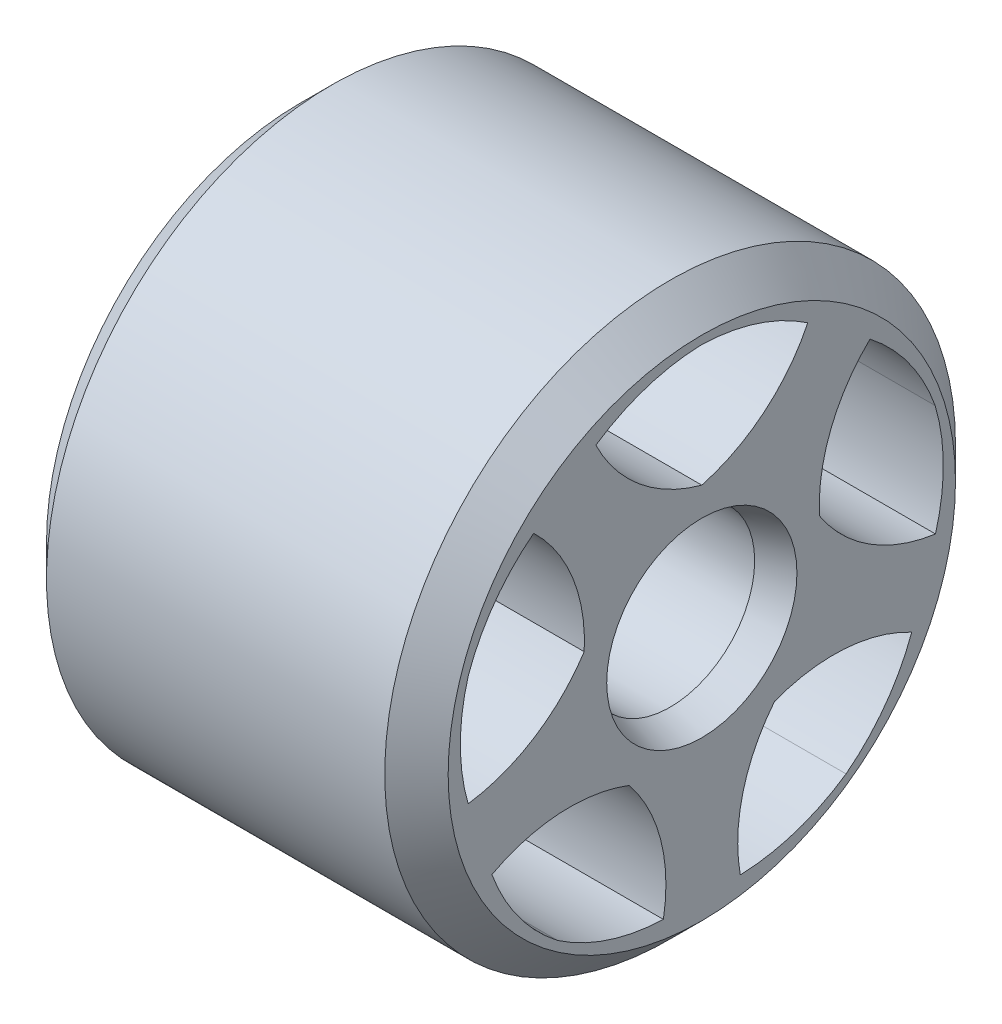
ISO-10303-21;
HEADER;
FILE_DESCRIPTION(('STEP AP214'),'2;1');
FILE_NAME('part.step','',(''),(''),'','','');
FILE_SCHEMA(('AUTOMOTIVE_DESIGN { 1 0 10303 214 1 1 1 1 }'));
ENDSEC;
DATA;
#1=APPLICATION_CONTEXT('core data for automotive mechanical design processes');
#2=APPLICATION_PROTOCOL_DEFINITION('international standard','automotive_design',2000,#1);
#3=PRODUCT_CONTEXT('',#1,'mechanical');
#4=PRODUCT('Part','Part','',(#3));
#5=PRODUCT_RELATED_PRODUCT_CATEGORY('part','',(#4));
#6=PRODUCT_DEFINITION_FORMATION('','',#4);
#7=PRODUCT_DEFINITION_CONTEXT('part definition',#1,'design');
#8=PRODUCT_DEFINITION('design','',#6,#7);
#9=PRODUCT_DEFINITION_SHAPE('','',#8);
#10=(LENGTH_UNIT() NAMED_UNIT(*) SI_UNIT(.MILLI.,.METRE.));
#11=(NAMED_UNIT(*) PLANE_ANGLE_UNIT() SI_UNIT($,.RADIAN.));
#12=(NAMED_UNIT(*) SI_UNIT($,.STERADIAN.) SOLID_ANGLE_UNIT());
#13=UNCERTAINTY_MEASURE_WITH_UNIT(LENGTH_MEASURE(1.E-05),#10,'distance_accuracy_value','');
#14=(GEOMETRIC_REPRESENTATION_CONTEXT(3) GLOBAL_UNCERTAINTY_ASSIGNED_CONTEXT((#13)) GLOBAL_UNIT_ASSIGNED_CONTEXT((#10,
#11,#12)) REPRESENTATION_CONTEXT('',''));
#15=CARTESIAN_POINT('',(0.,0.,0.));
#16=DIRECTION('',(0.,0.,1.));
#17=DIRECTION('',(1.,0.,0.));
#18=AXIS2_PLACEMENT_3D('',#15,#16,#17);
#19=CARTESIAN_POINT('',(9.5,0.,0.));
#20=DIRECTION('',(1.,0.,0.));
#21=DIRECTION('',(0.,0.,-1.));
#22=AXIS2_PLACEMENT_3D('',#19,#20,#21);
#23=PLANE('',#22);
#24=CARTESIAN_POINT('',(9.5,0.,0.));
#25=DIRECTION('',(1.,0.,0.));
#26=DIRECTION('',(0.,0.,-1.));
#27=AXIS2_PLACEMENT_3D('',#24,#25,#26);
#28=CIRCLE('',#27,4.50000000000001);
#29=CARTESIAN_POINT('',(9.5,0.,-4.50000000000001));
#30=VERTEX_POINT('',#29);
#31=EDGE_CURVE('E11',#30,#30,#28,.F.);
#32=ORIENTED_EDGE('',*,*,#31,.T.);
#33=EDGE_LOOP('',(#32));
#34=FACE_BOUND('',#33,.T.);
#35=CARTESIAN_POINT('',(9.5,0.,0.));
#36=DIRECTION('',(1.,0.,0.));
#37=DIRECTION('',(0.,0.,-1.));
#38=AXIS2_PLACEMENT_3D('',#35,#36,#37);
#39=CIRCLE('',#38,12.);
#40=CARTESIAN_POINT('',(9.5,0.,-12.));
#41=VERTEX_POINT('',#40);
#42=EDGE_CURVE('E344',#41,#41,#39,.T.);
#43=ORIENTED_EDGE('',*,*,#42,.T.);
#44=EDGE_LOOP('',(#43));
#45=FACE_BOUND('',#44,.T.);
#46=CARTESIAN_POINT('',(9.5,0.931815794103075,-2.02933749414677));
#47=DIRECTION('',(1.,0.,0.));
#48=DIRECTION('',(0.,-0.95105651629515,-0.309016994374958));
#49=AXIS2_PLACEMENT_3D('',#46,#47,#48);
#50=CIRCLE('',#49,9.39432433543306);
#51=CARTESIAN_POINT('',(9.5,-1.678595206542,-11.0536980879518));
#52=VERTEX_POINT('',#51);
#53=CARTESIAN_POINT('',(9.5,3.58728925984448,-11.0405410981085));
#54=VERTEX_POINT('',#53);
#55=EDGE_CURVE('E260',#52,#54,#50,.T.);
#56=ORIENTED_EDGE('',*,*,#55,.F.);
#57=CARTESIAN_POINT('',(9.5,6.08419028301145,-12.1309249973145));
#58=DIRECTION('',(1.,0.,0.));
#59=DIRECTION('',(0.,-0.95105651629515,-0.309016994374958));
#60=AXIS2_PLACEMENT_3D('',#57,#58,#59);
#61=CIRCLE('',#60,7.8371714521935);
#62=CARTESIAN_POINT('',(9.5,1.80765526838161,-5.56339086038598));
#63=VERTEX_POINT('',#62);
#64=EDGE_CURVE('E258',#63,#52,#61,.T.);
#65=ORIENTED_EDGE('',*,*,#64,.F.);
#66=CARTESIAN_POINT('',(9.5,2.2081654741207,-13.3903218008106));
#67=DIRECTION('',(1.,0.,0.));
#68=DIRECTION('',(0.,0.95105651629515,0.309016994374958));
#69=AXIS2_PLACEMENT_3D('',#66,#67,#68);
#70=CIRCLE('',#69,7.8371714521935);
#71=CARTESIAN_POINT('',(9.5,7.85521276816055,-7.95597609686846));
#72=VERTEX_POINT('',#71);
#73=EDGE_CURVE('E264',#72,#63,#70,.T.);
#74=ORIENTED_EDGE('',*,*,#73,.F.);
#75=CARTESIAN_POINT('',(9.5,0.43895983792731,-2.18947610171399));
#76=DIRECTION('',(1.,0.,0.));
#77=DIRECTION('',(0.,0.95105651629515,0.309016994374958));
#78=AXIS2_PLACEMENT_3D('',#75,#76,#77);
#79=CIRCLE('',#78,9.39432433543306);
#80=EDGE_CURVE('E262',#54,#72,#79,.T.);
#81=ORIENTED_EDGE('',*,*,#80,.F.);
#82=EDGE_LOOP('',(#56,#65,#74,#81));
#83=FACE_BOUND('',#82,.T.);
#84=CARTESIAN_POINT('',(9.5,-1.64206773156553,-1.51330925598209));
#85=DIRECTION('',(1.,0.,0.));
#86=DIRECTION('',(0.,-0.58778525229248,0.809016994374942));
#87=AXIS2_PLACEMENT_3D('',#84,#85,#86);
#88=CIRCLE('',#87,9.39432433543306);
#89=CARTESIAN_POINT('',(9.5,-11.0314060412036,-1.81934165046336));
#90=VERTEX_POINT('',#89);
#91=CARTESIAN_POINT('',(9.5,-9.3916452097499,-6.82342965282126));
#92=VERTEX_POINT('',#91);
#93=EDGE_CURVE('E235',#90,#92,#88,.T.);
#94=ORIENTED_EDGE('',*,*,#93,.F.);
#95=CARTESIAN_POINT('',(9.5,-9.65707707292231,-9.53507079669572));
#96=DIRECTION('',(1.,0.,0.));
#97=DIRECTION('',(0.,-0.58778525229248,0.809016994374942));
#98=AXIS2_PLACEMENT_3D('',#95,#96,#97);
#99=CIRCLE('',#98,7.8371714521935);
#100=CARTESIAN_POINT('',(9.5,-4.73250293256568,-3.43836464441911));
#101=VERTEX_POINT('',#100);
#102=EDGE_CURVE('E233',#101,#90,#99,.T.);
#103=ORIENTED_EDGE('',*,*,#102,.F.);
#104=CARTESIAN_POINT('',(9.5,-12.0525921460546,-6.23792715982025));
#105=DIRECTION('',(1.,0.,0.));
#106=DIRECTION('',(0.,0.58778525229248,-0.809016994374942));
#107=AXIS2_PLACEMENT_3D('',#104,#105,#106);
#108=CIRCLE('',#107,7.8371714521935);
#109=CARTESIAN_POINT('',(9.5,-5.13918867062257,-9.92928311081719));
#110=VERTEX_POINT('',#109);
#111=EDGE_CURVE('E239',#110,#101,#108,.T.);
#112=ORIENTED_EDGE('',*,*,#111,.F.);
#113=CARTESIAN_POINT('',(9.5,-1.94666946403999,-1.09406093846006));
#114=DIRECTION('',(1.,0.,0.));
#115=DIRECTION('',(0.,0.58778525229248,-0.809016994374942));
#116=AXIS2_PLACEMENT_3D('',#113,#114,#115);
#117=CIRCLE('',#116,9.39432433543306);
#118=EDGE_CURVE('E237',#92,#110,#117,.T.);
#119=ORIENTED_EDGE('',*,*,#118,.F.);
#120=EDGE_LOOP('',(#94,#103,#112,#119));
#121=FACE_BOUND('',#120,.T.);
#122=CARTESIAN_POINT('',(9.5,-1.94666946404,1.09406093846003));
#123=DIRECTION('',(1.,0.,0.));
#124=DIRECTION('',(0.,0.587785252292469,0.809016994374951));
#125=AXIS2_PLACEMENT_3D('',#122,#123,#124);
#126=CIRCLE('',#125,9.39432433543306);
#127=CARTESIAN_POINT('',(9.5,-5.13918867062272,9.92928311081712));
#128=VERTEX_POINT('',#127);
#129=CARTESIAN_POINT('',(9.5,-9.39164520975,6.82342965282112));
#130=VERTEX_POINT('',#129);
#131=EDGE_CURVE('E208',#128,#130,#126,.T.);
#132=ORIENTED_EDGE('',*,*,#131,.F.);
#133=CARTESIAN_POINT('',(9.5,-12.0525921460547,6.23792715982008));
#134=DIRECTION('',(1.,0.,0.));
#135=DIRECTION('',(0.,0.587785252292469,0.809016994374951));
#136=AXIS2_PLACEMENT_3D('',#133,#134,#135);
#137=CIRCLE('',#136,7.8371714521935);
#138=CARTESIAN_POINT('',(9.5,-4.73250293256573,3.43836464441905));
#139=VERTEX_POINT('',#138);
#140=EDGE_CURVE('E180',#139,#128,#137,.T.);
#141=ORIENTED_EDGE('',*,*,#140,.F.);
#142=CARTESIAN_POINT('',(9.5,-9.65707707292245,9.53507079669558));
#143=DIRECTION('',(1.,0.,0.));
#144=DIRECTION('',(0.,-0.587785252292469,-0.809016994374951));
#145=AXIS2_PLACEMENT_3D('',#142,#143,#144);
#146=CIRCLE('',#145,7.8371714521935);
#147=CARTESIAN_POINT('',(9.5,-11.0314060412037,1.81934165046321));
#148=VERTEX_POINT('',#147);
#149=EDGE_CURVE('E213',#148,#139,#146,.T.);
#150=ORIENTED_EDGE('',*,*,#149,.F.);
#151=CARTESIAN_POINT('',(9.5,-1.64206773156555,1.51330925598207));
#152=DIRECTION('',(1.,0.,0.));
#153=DIRECTION('',(0.,-0.587785252292469,-0.809016994374951));
#154=AXIS2_PLACEMENT_3D('',#151,#152,#153);
#155=CIRCLE('',#154,9.39432433543306);
#156=EDGE_CURVE('E210',#130,#148,#155,.T.);
#157=ORIENTED_EDGE('',*,*,#156,.F.);
#158=EDGE_LOOP('',(#132,#141,#150,#157));
#159=FACE_BOUND('',#158,.T.);
#160=CARTESIAN_POINT('',(9.5,0.438959837927279,2.18947610171399));
#161=DIRECTION('',(1.,0.,0.));
#162=DIRECTION('',(0.,0.951056516295155,-0.309016994374945));
#163=AXIS2_PLACEMENT_3D('',#160,#161,#162);
#164=CIRCLE('',#163,9.39432433543306);
#165=CARTESIAN_POINT('',(9.5,7.85521276816044,7.95597609686858));
#166=VERTEX_POINT('',#165);
#167=CARTESIAN_POINT('',(9.5,3.58728925984432,11.0405410981086));
#168=VERTEX_POINT('',#167);
#169=EDGE_CURVE('E286',#166,#168,#164,.T.);
#170=ORIENTED_EDGE('',*,*,#169,.F.);
#171=CARTESIAN_POINT('',(9.5,2.20816547412051,13.3903218008106));
#172=DIRECTION('',(1.,0.,0.));
#173=DIRECTION('',(0.,0.951056516295155,-0.309016994374945));
#174=AXIS2_PLACEMENT_3D('',#171,#172,#173);
#175=CIRCLE('',#174,7.8371714521935);
#176=CARTESIAN_POINT('',(9.5,1.80765526838153,5.56339086038601));
#177=VERTEX_POINT('',#176);
#178=EDGE_CURVE('E284',#177,#166,#175,.T.);
#179=ORIENTED_EDGE('',*,*,#178,.F.);
#180=CARTESIAN_POINT('',(9.5,6.08419028301128,12.1309249973146));
#181=DIRECTION('',(1.,0.,0.));
#182=DIRECTION('',(0.,-0.951056516295155,0.309016994374945));
#183=AXIS2_PLACEMENT_3D('',#180,#181,#182);
#184=CIRCLE('',#183,7.8371714521935);
#185=CARTESIAN_POINT('',(9.5,-1.67859520654215,11.0536980879518));
#186=VERTEX_POINT('',#185);
#187=EDGE_CURVE('E291',#186,#177,#184,.T.);
#188=ORIENTED_EDGE('',*,*,#187,.F.);
#189=CARTESIAN_POINT('',(9.5,0.931815794103047,2.02933749414678));
#190=DIRECTION('',(1.,0.,0.));
#191=DIRECTION('',(0.,-0.951056516295155,0.309016994374945));
#192=AXIS2_PLACEMENT_3D('',#189,#190,#191);
#193=CIRCLE('',#192,9.39432433543306);
#194=EDGE_CURVE('E288',#168,#186,#193,.T.);
#195=ORIENTED_EDGE('',*,*,#194,.F.);
#196=EDGE_LOOP('',(#170,#179,#188,#195));
#197=FACE_BOUND('',#196,.T.);
#198=CARTESIAN_POINT('',(9.5,2.21796156357521,0.259109709954825));
#199=DIRECTION('',(1.,0.,0.));
#200=DIRECTION('',(0.,0.,-1.));
#201=AXIS2_PLACEMENT_3D('',#198,#199,#200);
#202=CIRCLE('',#201,9.39432433543306);
#203=CARTESIAN_POINT('',(9.5,9.99397715020798,-5.01221946927066));
#204=VERTEX_POINT('',#203);
#205=CARTESIAN_POINT('',(9.5,11.6087118998112,0.));
#206=VERTEX_POINT('',#205);
#207=EDGE_CURVE('E316',#204,#206,#202,.T.);
#208=ORIENTED_EDGE('',*,*,#207,.F.);
#209=CARTESIAN_POINT('',(9.5,13.4173134618452,2.03774683337949));
#210=DIRECTION('',(1.,0.,0.));
#211=DIRECTION('',(0.,0.,-1.));
#212=AXIS2_PLACEMENT_3D('',#209,#210,#211);
#213=CIRCLE('',#212,7.8371714521935);
#214=CARTESIAN_POINT('',(9.5,5.84969532836832,0.));
#215=VERTEX_POINT('',#214);
#216=EDGE_CURVE('E314',#215,#204,#213,.T.);
#217=ORIENTED_EDGE('',*,*,#216,.F.);
#218=CARTESIAN_POINT('',(9.5,13.4173134618452,-2.03774683337949));
#219=DIRECTION('',(1.,0.,0.));
#220=DIRECTION('',(0.,0.,1.));
#221=AXIS2_PLACEMENT_3D('',#218,#219,#220);
#222=CIRCLE('',#221,7.8371714521935);
#223=CARTESIAN_POINT('',(9.5,9.99397715020798,5.01221946927066));
#224=VERTEX_POINT('',#223);
#225=EDGE_CURVE('E321',#224,#215,#222,.T.);
#226=ORIENTED_EDGE('',*,*,#225,.F.);
#227=CARTESIAN_POINT('',(9.5,2.21796156357521,-0.259109709954825));
#228=DIRECTION('',(1.,0.,0.));
#229=DIRECTION('',(0.,0.,1.));
#230=AXIS2_PLACEMENT_3D('',#227,#228,#229);
#231=CIRCLE('',#230,9.39432433543306);
#232=EDGE_CURVE('E318',#206,#224,#231,.T.);
#233=ORIENTED_EDGE('',*,*,#232,.F.);
#234=EDGE_LOOP('',(#208,#217,#226,#233));
#235=FACE_BOUND('',#234,.T.);
#236=ADVANCED_FACE('F35',(#34,#45,#83,#121,#159,#197,#235),#23,.T.);
#237=CARTESIAN_POINT('',(-9.5,0.,0.));
#238=DIRECTION('',(1.,0.,0.));
#239=DIRECTION('',(0.,0.,-1.));
#240=AXIS2_PLACEMENT_3D('',#237,#238,#239);
#241=PLANE('',#240);
#242=CARTESIAN_POINT('',(-9.5,0.,0.));
#243=DIRECTION('',(1.,0.,0.));
#244=DIRECTION('',(0.,0.,-1.));
#245=AXIS2_PLACEMENT_3D('',#242,#243,#244);
#246=CIRCLE('',#245,12.);
#247=CARTESIAN_POINT('',(-9.5,0.,-12.));
#248=VERTEX_POINT('',#247);
#249=EDGE_CURVE('E341',#248,#248,#246,.F.);
#250=ORIENTED_EDGE('',*,*,#249,.T.);
#251=EDGE_LOOP('',(#250));
#252=FACE_BOUND('',#251,.T.);
#253=CARTESIAN_POINT('',(-9.5,6.08419028301145,-12.1309249973145));
#254=DIRECTION('',(1.,0.,0.));
#255=DIRECTION('',(0.,-0.95105651629515,-0.309016994374958));
#256=AXIS2_PLACEMENT_3D('',#253,#254,#255);
#257=CIRCLE('',#256,7.8371714521935);
#258=CARTESIAN_POINT('',(-9.5,1.80765526838161,-5.56339086038598));
#259=VERTEX_POINT('',#258);
#260=CARTESIAN_POINT('',(-9.5,-1.678595206542,-11.0536980879518));
#261=VERTEX_POINT('',#260);
#262=EDGE_CURVE('E246',#259,#261,#257,.T.);
#263=ORIENTED_EDGE('',*,*,#262,.T.);
#264=CARTESIAN_POINT('',(-9.5,0.931815794103075,-2.02933749414677));
#265=DIRECTION('',(1.,0.,0.));
#266=DIRECTION('',(0.,-0.95105651629515,-0.309016994374958));
#267=AXIS2_PLACEMENT_3D('',#264,#265,#266);
#268=CIRCLE('',#267,9.39432433543306);
#269=CARTESIAN_POINT('',(-9.5,3.58728925984448,-11.0405410981085));
#270=VERTEX_POINT('',#269);
#271=EDGE_CURVE('E249',#261,#270,#268,.T.);
#272=ORIENTED_EDGE('',*,*,#271,.T.);
#273=CARTESIAN_POINT('',(-9.5,0.43895983792731,-2.18947610171399));
#274=DIRECTION('',(1.,0.,0.));
#275=DIRECTION('',(0.,0.95105651629515,0.309016994374958));
#276=AXIS2_PLACEMENT_3D('',#273,#274,#275);
#277=CIRCLE('',#276,9.39432433543306);
#278=CARTESIAN_POINT('',(-9.5,7.85521276816055,-7.95597609686846));
#279=VERTEX_POINT('',#278);
#280=EDGE_CURVE('E252',#270,#279,#277,.T.);
#281=ORIENTED_EDGE('',*,*,#280,.T.);
#282=CARTESIAN_POINT('',(-9.5,2.2081654741207,-13.3903218008106));
#283=DIRECTION('',(1.,0.,0.));
#284=DIRECTION('',(0.,0.95105651629515,0.309016994374958));
#285=AXIS2_PLACEMENT_3D('',#282,#283,#284);
#286=CIRCLE('',#285,7.8371714521935);
#287=EDGE_CURVE('E255',#279,#259,#286,.T.);
#288=ORIENTED_EDGE('',*,*,#287,.T.);
#289=EDGE_LOOP('',(#263,#272,#281,#288));
#290=FACE_BOUND('',#289,.T.);
#291=CARTESIAN_POINT('',(-9.5,-9.65707707292231,-9.53507079669572));
#292=DIRECTION('',(1.,0.,0.));
#293=DIRECTION('',(0.,-0.58778525229248,0.809016994374942));
#294=AXIS2_PLACEMENT_3D('',#291,#292,#293);
#295=CIRCLE('',#294,7.8371714521935);
#296=CARTESIAN_POINT('',(-9.5,-4.73250293256567,-3.43836464441911));
#297=VERTEX_POINT('',#296);
#298=CARTESIAN_POINT('',(-9.5,-11.0314060412036,-1.81934165046336));
#299=VERTEX_POINT('',#298);
#300=EDGE_CURVE('E220',#297,#299,#295,.T.);
#301=ORIENTED_EDGE('',*,*,#300,.T.);
#302=CARTESIAN_POINT('',(-9.5,-1.64206773156553,-1.51330925598209));
#303=DIRECTION('',(1.,0.,0.));
#304=DIRECTION('',(0.,-0.58778525229248,0.809016994374942));
#305=AXIS2_PLACEMENT_3D('',#302,#303,#304);
#306=CIRCLE('',#305,9.39432433543306);
#307=CARTESIAN_POINT('',(-9.5,-9.3916452097499,-6.82342965282126));
#308=VERTEX_POINT('',#307);
#309=EDGE_CURVE('E223',#299,#308,#306,.T.);
#310=ORIENTED_EDGE('',*,*,#309,.T.);
#311=CARTESIAN_POINT('',(-9.5,-1.94666946403999,-1.09406093846006));
#312=DIRECTION('',(1.,0.,0.));
#313=DIRECTION('',(0.,0.58778525229248,-0.809016994374942));
#314=AXIS2_PLACEMENT_3D('',#311,#312,#313);
#315=CIRCLE('',#314,9.39432433543306);
#316=CARTESIAN_POINT('',(-9.5,-5.13918867062257,-9.92928311081719));
#317=VERTEX_POINT('',#316);
#318=EDGE_CURVE('E227',#308,#317,#315,.T.);
#319=ORIENTED_EDGE('',*,*,#318,.T.);
#320=CARTESIAN_POINT('',(-9.5,-12.0525921460546,-6.23792715982025));
#321=DIRECTION('',(1.,0.,0.));
#322=DIRECTION('',(0.,0.58778525229248,-0.809016994374942));
#323=AXIS2_PLACEMENT_3D('',#320,#321,#322);
#324=CIRCLE('',#323,7.8371714521935);
#325=EDGE_CURVE('E230',#317,#297,#324,.T.);
#326=ORIENTED_EDGE('',*,*,#325,.T.);
#327=EDGE_LOOP('',(#301,#310,#319,#326));
#328=FACE_BOUND('',#327,.T.);
#329=CARTESIAN_POINT('',(-9.5,-12.0525921460547,6.23792715982008));
#330=DIRECTION('',(1.,0.,0.));
#331=DIRECTION('',(0.,0.587785252292469,0.809016994374951));
#332=AXIS2_PLACEMENT_3D('',#329,#330,#331);
#333=CIRCLE('',#332,7.8371714521935);
#334=CARTESIAN_POINT('',(-9.5,-4.73250293256573,3.43836464441905));
#335=VERTEX_POINT('',#334);
#336=CARTESIAN_POINT('',(-9.5,-5.13918867062272,9.92928311081712));
#337=VERTEX_POINT('',#336);
#338=EDGE_CURVE('E177',#335,#337,#333,.T.);
#339=ORIENTED_EDGE('',*,*,#338,.T.);
#340=CARTESIAN_POINT('',(-9.5,-1.94666946404,1.09406093846003));
#341=DIRECTION('',(1.,0.,0.));
#342=DIRECTION('',(0.,0.587785252292469,0.809016994374951));
#343=AXIS2_PLACEMENT_3D('',#340,#341,#342);
#344=CIRCLE('',#343,9.39432433543306);
#345=CARTESIAN_POINT('',(-9.5,-9.39164520975,6.82342965282112));
#346=VERTEX_POINT('',#345);
#347=EDGE_CURVE('E187',#337,#346,#344,.T.);
#348=ORIENTED_EDGE('',*,*,#347,.T.);
#349=CARTESIAN_POINT('',(-9.5,-1.64206773156555,1.51330925598207));
#350=DIRECTION('',(1.,0.,0.));
#351=DIRECTION('',(0.,-0.587785252292469,-0.809016994374951));
#352=AXIS2_PLACEMENT_3D('',#349,#350,#351);
#353=CIRCLE('',#352,9.39432433543306);
#354=CARTESIAN_POINT('',(-9.5,-11.0314060412037,1.8193416504632));
#355=VERTEX_POINT('',#354);
#356=EDGE_CURVE('E193',#346,#355,#353,.T.);
#357=ORIENTED_EDGE('',*,*,#356,.T.);
#358=CARTESIAN_POINT('',(-9.5,-9.65707707292245,9.53507079669558));
#359=DIRECTION('',(1.,0.,0.));
#360=DIRECTION('',(0.,-0.587785252292469,-0.809016994374951));
#361=AXIS2_PLACEMENT_3D('',#358,#359,#360);
#362=CIRCLE('',#361,7.8371714521935);
#363=EDGE_CURVE('E199',#355,#335,#362,.T.);
#364=ORIENTED_EDGE('',*,*,#363,.T.);
#365=EDGE_LOOP('',(#339,#348,#357,#364));
#366=FACE_BOUND('',#365,.T.);
#367=CARTESIAN_POINT('',(-9.5,2.20816547412051,13.3903218008106));
#368=DIRECTION('',(1.,0.,0.));
#369=DIRECTION('',(0.,0.951056516295155,-0.309016994374945));
#370=AXIS2_PLACEMENT_3D('',#367,#368,#369);
#371=CIRCLE('',#370,7.8371714521935);
#372=CARTESIAN_POINT('',(-9.5,1.80765526838153,5.56339086038601));
#373=VERTEX_POINT('',#372);
#374=CARTESIAN_POINT('',(-9.5,7.85521276816044,7.95597609686858));
#375=VERTEX_POINT('',#374);
#376=EDGE_CURVE('E183',#373,#375,#371,.T.);
#377=ORIENTED_EDGE('',*,*,#376,.T.);
#378=CARTESIAN_POINT('',(-9.5,0.438959837927279,2.18947610171399));
#379=DIRECTION('',(1.,0.,0.));
#380=DIRECTION('',(0.,0.951056516295155,-0.309016994374945));
#381=AXIS2_PLACEMENT_3D('',#378,#379,#380);
#382=CIRCLE('',#381,9.39432433543306);
#383=CARTESIAN_POINT('',(-9.5,3.58728925984432,11.0405410981086));
#384=VERTEX_POINT('',#383);
#385=EDGE_CURVE('E275',#375,#384,#382,.T.);
#386=ORIENTED_EDGE('',*,*,#385,.T.);
#387=CARTESIAN_POINT('',(-9.5,0.931815794103047,2.02933749414678));
#388=DIRECTION('',(1.,0.,0.));
#389=DIRECTION('',(0.,-0.951056516295155,0.309016994374945));
#390=AXIS2_PLACEMENT_3D('',#387,#388,#389);
#391=CIRCLE('',#390,9.39432433543306);
#392=CARTESIAN_POINT('',(-9.5,-1.67859520654215,11.0536980879518));
#393=VERTEX_POINT('',#392);
#394=EDGE_CURVE('E278',#384,#393,#391,.T.);
#395=ORIENTED_EDGE('',*,*,#394,.T.);
#396=CARTESIAN_POINT('',(-9.5,6.08419028301128,12.1309249973146));
#397=DIRECTION('',(1.,0.,0.));
#398=DIRECTION('',(0.,-0.951056516295155,0.309016994374945));
#399=AXIS2_PLACEMENT_3D('',#396,#397,#398);
#400=CIRCLE('',#399,7.8371714521935);
#401=EDGE_CURVE('E281',#393,#373,#400,.T.);
#402=ORIENTED_EDGE('',*,*,#401,.T.);
#403=EDGE_LOOP('',(#377,#386,#395,#402));
#404=FACE_BOUND('',#403,.T.);
#405=CARTESIAN_POINT('',(-9.5,13.4173134618452,2.03774683337949));
#406=DIRECTION('',(1.,0.,0.));
#407=DIRECTION('',(0.,0.,-1.));
#408=AXIS2_PLACEMENT_3D('',#405,#406,#407);
#409=CIRCLE('',#408,7.8371714521935);
#410=CARTESIAN_POINT('',(-9.5,5.84969532836832,0.));
#411=VERTEX_POINT('',#410);
#412=CARTESIAN_POINT('',(-9.5,9.99397715020798,-5.01221946927066));
#413=VERTEX_POINT('',#412);
#414=EDGE_CURVE('E302',#411,#413,#409,.T.);
#415=ORIENTED_EDGE('',*,*,#414,.T.);
#416=CARTESIAN_POINT('',(-9.5,2.21796156357521,0.259109709954825));
#417=DIRECTION('',(1.,0.,0.));
#418=DIRECTION('',(0.,0.,-1.));
#419=AXIS2_PLACEMENT_3D('',#416,#417,#418);
#420=CIRCLE('',#419,9.39432433543306);
#421=CARTESIAN_POINT('',(-9.5,11.6087118998112,0.));
#422=VERTEX_POINT('',#421);
#423=EDGE_CURVE('E305',#413,#422,#420,.T.);
#424=ORIENTED_EDGE('',*,*,#423,.T.);
#425=CARTESIAN_POINT('',(-9.5,2.21796156357521,-0.259109709954825));
#426=DIRECTION('',(1.,0.,0.));
#427=DIRECTION('',(0.,0.,1.));
#428=AXIS2_PLACEMENT_3D('',#425,#426,#427);
#429=CIRCLE('',#428,9.39432433543306);
#430=CARTESIAN_POINT('',(-9.5,9.99397715020798,5.01221946927066));
#431=VERTEX_POINT('',#430);
#432=EDGE_CURVE('E308',#422,#431,#429,.T.);
#433=ORIENTED_EDGE('',*,*,#432,.T.);
#434=CARTESIAN_POINT('',(-9.5,13.4173134618452,-2.03774683337949));
#435=DIRECTION('',(1.,0.,0.));
#436=DIRECTION('',(0.,0.,1.));
#437=AXIS2_PLACEMENT_3D('',#434,#435,#436);
#438=CIRCLE('',#437,7.8371714521935);
#439=EDGE_CURVE('E311',#431,#411,#438,.T.);
#440=ORIENTED_EDGE('',*,*,#439,.T.);
#441=EDGE_LOOP('',(#415,#424,#433,#440));
#442=FACE_BOUND('',#441,.T.);
#443=CARTESIAN_POINT('',(-9.5,0.,0.));
#444=DIRECTION('',(1.,0.,0.));
#445=DIRECTION('',(0.,0.,-1.));
#446=AXIS2_PLACEMENT_3D('',#443,#444,#445);
#447=CIRCLE('',#446,4.);
#448=CARTESIAN_POINT('',(-9.5,0.,-4.));
#449=VERTEX_POINT('',#448);
#450=EDGE_CURVE('E332',#449,#449,#447,.T.);
#451=ORIENTED_EDGE('',*,*,#450,.T.);
#452=EDGE_LOOP('',(#451));
#453=FACE_BOUND('',#452,.T.);
#454=ADVANCED_FACE('F196',(#252,#290,#328,#366,#404,#442,#453),#241,.F.);
#455=CARTESIAN_POINT('',(9.5,0.,0.));
#456=DIRECTION('',(-1.,0.,0.));
#457=DIRECTION('',(0.,0.,1.));
#458=AXIS2_PLACEMENT_3D('',#455,#456,#457);
#459=CYLINDRICAL_SURFACE('',#458,13.5);
#460=CARTESIAN_POINT('',(-8.,0.,0.));
#461=DIRECTION('',(1.,0.,0.));
#462=DIRECTION('',(0.,0.,-1.));
#463=AXIS2_PLACEMENT_3D('',#460,#461,#462);
#464=CIRCLE('',#463,13.5);
#465=CARTESIAN_POINT('',(-8.,0.,-13.5));
#466=VERTEX_POINT('',#465);
#467=EDGE_CURVE('E338',#466,#466,#464,.T.);
#468=ORIENTED_EDGE('',*,*,#467,.T.);
#469=EDGE_LOOP('',(#468));
#470=FACE_BOUND('',#469,.T.);
#471=CARTESIAN_POINT('',(7.99999999999998,0.,0.));
#472=DIRECTION('',(1.,0.,0.));
#473=DIRECTION('',(0.,0.,-1.));
#474=AXIS2_PLACEMENT_3D('',#471,#472,#473);
#475=CIRCLE('',#474,13.5);
#476=CARTESIAN_POINT('',(7.99999999999998,0.,-13.5));
#477=VERTEX_POINT('',#476);
#478=EDGE_CURVE('E335',#477,#477,#475,.F.);
#479=ORIENTED_EDGE('',*,*,#478,.T.);
#480=EDGE_LOOP('',(#479));
#481=FACE_BOUND('',#480,.T.);
#482=ADVANCED_FACE('F367',(#470,#481),#459,.T.);
#483=CARTESIAN_POINT('',(9.5,0.,0.));
#484=DIRECTION('',(-1.,0.,0.));
#485=DIRECTION('',(0.,0.,1.));
#486=AXIS2_PLACEMENT_3D('',#483,#484,#485);
#487=CYLINDRICAL_SURFACE('',#486,4.);
#488=CARTESIAN_POINT('',(7.99999999999997,0.,0.));
#489=DIRECTION('',(1.,0.,0.));
#490=DIRECTION('',(0.,0.,-1.));
#491=AXIS2_PLACEMENT_3D('',#488,#489,#490);
#492=CIRCLE('',#491,4.);
#493=CARTESIAN_POINT('',(7.99999999999997,0.,-4.));
#494=VERTEX_POINT('',#493);
#495=EDGE_CURVE('E44',#494,#494,#492,.T.);
#496=ORIENTED_EDGE('',*,*,#495,.T.);
#497=EDGE_LOOP('',(#496));
#498=FACE_BOUND('',#497,.T.);
#499=ORIENTED_EDGE('',*,*,#450,.F.);
#500=EDGE_LOOP('',(#499));
#501=FACE_BOUND('',#500,.T.);
#502=ADVANCED_FACE('F349',(#498,#501),#487,.F.);
#503=CARTESIAN_POINT('',(9.5,13.4173134618452,2.03774683337949));
#504=DIRECTION('',(-1.,0.,0.));
#505=DIRECTION('',(0.,0.,1.));
#506=AXIS2_PLACEMENT_3D('',#503,#504,#505);
#507=CYLINDRICAL_SURFACE('',#506,7.8371714521935);
#508=DIRECTION('',(-1.,0.,0.));
#509=VECTOR('',#508,1.);
#510=CARTESIAN_POINT('',(9.5,5.84969532836832,0.));
#511=LINE('',#510,#509);
#512=EDGE_CURVE('E323',#215,#411,#511,.T.);
#513=ORIENTED_EDGE('',*,*,#512,.F.);
#514=ORIENTED_EDGE('',*,*,#216,.T.);
#515=DIRECTION('',(-1.,0.,0.));
#516=VECTOR('',#515,1.);
#517=CARTESIAN_POINT('',(9.5,9.99397715020798,-5.01221946927066));
#518=LINE('',#517,#516);
#519=EDGE_CURVE('E330',#204,#413,#518,.T.);
#520=ORIENTED_EDGE('',*,*,#519,.T.);
#521=ORIENTED_EDGE('',*,*,#414,.F.);
#522=EDGE_LOOP('',(#513,#514,#520,#521));
#523=FACE_BOUND('',#522,.T.);
#524=ADVANCED_FACE('F432',(#523),#507,.F.);
#525=CARTESIAN_POINT('',(9.5,2.21796156357521,0.259109709954825));
#526=DIRECTION('',(-1.,0.,0.));
#527=DIRECTION('',(0.,0.,1.));
#528=AXIS2_PLACEMENT_3D('',#525,#526,#527);
#529=CYLINDRICAL_SURFACE('',#528,9.39432433543306);
#530=ORIENTED_EDGE('',*,*,#519,.F.);
#531=ORIENTED_EDGE('',*,*,#207,.T.);
#532=DIRECTION('',(-1.,0.,0.));
#533=VECTOR('',#532,1.);
#534=CARTESIAN_POINT('',(9.5,11.6087118998112,0.));
#535=LINE('',#534,#533);
#536=EDGE_CURVE('E328',#206,#422,#535,.T.);
#537=ORIENTED_EDGE('',*,*,#536,.T.);
#538=ORIENTED_EDGE('',*,*,#423,.F.);
#539=EDGE_LOOP('',(#530,#531,#537,#538));
#540=FACE_BOUND('',#539,.T.);
#541=ADVANCED_FACE('F422',(#540),#529,.F.);
#542=CARTESIAN_POINT('',(9.5,2.21796156357521,-0.259109709954825));
#543=DIRECTION('',(-1.,0.,0.));
#544=DIRECTION('',(0.,0.,1.));
#545=AXIS2_PLACEMENT_3D('',#542,#543,#544);
#546=CYLINDRICAL_SURFACE('',#545,9.39432433543306);
#547=ORIENTED_EDGE('',*,*,#536,.F.);
#548=ORIENTED_EDGE('',*,*,#232,.T.);
#549=DIRECTION('',(-1.,0.,0.));
#550=VECTOR('',#549,1.);
#551=CARTESIAN_POINT('',(9.5,9.99397715020798,5.01221946927066));
#552=LINE('',#551,#550);
#553=EDGE_CURVE('E326',#224,#431,#552,.T.);
#554=ORIENTED_EDGE('',*,*,#553,.T.);
#555=ORIENTED_EDGE('',*,*,#432,.F.);
#556=EDGE_LOOP('',(#547,#548,#554,#555));
#557=FACE_BOUND('',#556,.T.);
#558=ADVANCED_FACE('F426',(#557),#546,.F.);
#559=CARTESIAN_POINT('',(9.5,13.4173134618452,-2.03774683337949));
#560=DIRECTION('',(-1.,0.,0.));
#561=DIRECTION('',(0.,0.,1.));
#562=AXIS2_PLACEMENT_3D('',#559,#560,#561);
#563=CYLINDRICAL_SURFACE('',#562,7.8371714521935);
#564=ORIENTED_EDGE('',*,*,#553,.F.);
#565=ORIENTED_EDGE('',*,*,#225,.T.);
#566=ORIENTED_EDGE('',*,*,#512,.T.);
#567=ORIENTED_EDGE('',*,*,#439,.F.);
#568=EDGE_LOOP('',(#564,#565,#566,#567));
#569=FACE_BOUND('',#568,.T.);
#570=ADVANCED_FACE('F434',(#569),#563,.F.);
#571=CARTESIAN_POINT('',(9.5,2.20816547412051,13.3903218008106));
#572=DIRECTION('',(-1.,0.,0.));
#573=DIRECTION('',(0.,0.,1.));
#574=AXIS2_PLACEMENT_3D('',#571,#572,#573);
#575=CYLINDRICAL_SURFACE('',#574,7.8371714521935);
#576=DIRECTION('',(-1.,0.,0.));
#577=VECTOR('',#576,1.);
#578=CARTESIAN_POINT('',(9.5,1.80765526838153,5.56339086038601));
#579=LINE('',#578,#577);
#580=EDGE_CURVE('E293',#177,#373,#579,.T.);
#581=ORIENTED_EDGE('',*,*,#580,.F.);
#582=ORIENTED_EDGE('',*,*,#178,.T.);
#583=DIRECTION('',(-1.,0.,0.));
#584=VECTOR('',#583,1.);
#585=CARTESIAN_POINT('',(9.5,7.85521276816044,7.95597609686858));
#586=LINE('',#585,#584);
#587=EDGE_CURVE('E300',#166,#375,#586,.T.);
#588=ORIENTED_EDGE('',*,*,#587,.T.);
#589=ORIENTED_EDGE('',*,*,#376,.F.);
#590=EDGE_LOOP('',(#581,#582,#588,#589));
#591=FACE_BOUND('',#590,.T.);
#592=ADVANCED_FACE('F436',(#591),#575,.F.);
#593=CARTESIAN_POINT('',(9.5,0.438959837927279,2.18947610171399));
#594=DIRECTION('',(-1.,0.,0.));
#595=DIRECTION('',(0.,0.,1.));
#596=AXIS2_PLACEMENT_3D('',#593,#594,#595);
#597=CYLINDRICAL_SURFACE('',#596,9.39432433543306);
#598=ORIENTED_EDGE('',*,*,#587,.F.);
#599=ORIENTED_EDGE('',*,*,#169,.T.);
#600=DIRECTION('',(-1.,0.,0.));
#601=VECTOR('',#600,1.);
#602=CARTESIAN_POINT('',(9.5,3.58728925984432,11.0405410981086));
#603=LINE('',#602,#601);
#604=EDGE_CURVE('E298',#168,#384,#603,.T.);
#605=ORIENTED_EDGE('',*,*,#604,.T.);
#606=ORIENTED_EDGE('',*,*,#385,.F.);
#607=EDGE_LOOP('',(#598,#599,#605,#606));
#608=FACE_BOUND('',#607,.T.);
#609=ADVANCED_FACE('F442',(#608),#597,.F.);
#610=CARTESIAN_POINT('',(9.5,0.931815794103047,2.02933749414678));
#611=DIRECTION('',(-1.,0.,0.));
#612=DIRECTION('',(0.,0.,1.));
#613=AXIS2_PLACEMENT_3D('',#610,#611,#612);
#614=CYLINDRICAL_SURFACE('',#613,9.39432433543306);
#615=ORIENTED_EDGE('',*,*,#604,.F.);
#616=ORIENTED_EDGE('',*,*,#194,.T.);
#617=DIRECTION('',(-1.,0.,0.));
#618=VECTOR('',#617,1.);
#619=CARTESIAN_POINT('',(9.5,-1.67859520654215,11.0536980879518));
#620=LINE('',#619,#618);
#621=EDGE_CURVE('E296',#186,#393,#620,.T.);
#622=ORIENTED_EDGE('',*,*,#621,.T.);
#623=ORIENTED_EDGE('',*,*,#394,.F.);
#624=EDGE_LOOP('',(#615,#616,#622,#623));
#625=FACE_BOUND('',#624,.T.);
#626=ADVANCED_FACE('F585',(#625),#614,.F.);
#627=CARTESIAN_POINT('',(9.5,6.08419028301128,12.1309249973146));
#628=DIRECTION('',(-1.,0.,0.));
#629=DIRECTION('',(0.,0.,1.));
#630=AXIS2_PLACEMENT_3D('',#627,#628,#629);
#631=CYLINDRICAL_SURFACE('',#630,7.8371714521935);
#632=ORIENTED_EDGE('',*,*,#621,.F.);
#633=ORIENTED_EDGE('',*,*,#187,.T.);
#634=ORIENTED_EDGE('',*,*,#580,.T.);
#635=ORIENTED_EDGE('',*,*,#401,.F.);
#636=EDGE_LOOP('',(#632,#633,#634,#635));
#637=FACE_BOUND('',#636,.T.);
#638=ADVANCED_FACE('F576',(#637),#631,.F.);
#639=CARTESIAN_POINT('',(9.5,-12.0525921460547,6.23792715982008));
#640=DIRECTION('',(-1.,0.,0.));
#641=DIRECTION('',(0.,0.,1.));
#642=AXIS2_PLACEMENT_3D('',#639,#640,#641);
#643=CYLINDRICAL_SURFACE('',#642,7.8371714521935);
#644=DIRECTION('',(-1.,0.,0.));
#645=VECTOR('',#644,1.);
#646=CARTESIAN_POINT('',(9.5,-4.73250293256573,3.43836464441905));
#647=LINE('',#646,#645);
#648=EDGE_CURVE('E215',#139,#335,#647,.T.);
#649=ORIENTED_EDGE('',*,*,#648,.F.);
#650=ORIENTED_EDGE('',*,*,#140,.T.);
#651=DIRECTION('',(-1.,0.,0.));
#652=VECTOR('',#651,1.);
#653=CARTESIAN_POINT('',(9.5,-5.13918867062272,9.92928311081712));
#654=LINE('',#653,#652);
#655=EDGE_CURVE('E172',#128,#337,#654,.T.);
#656=ORIENTED_EDGE('',*,*,#655,.T.);
#657=ORIENTED_EDGE('',*,*,#338,.F.);
#658=EDGE_LOOP('',(#649,#650,#656,#657));
#659=FACE_BOUND('',#658,.T.);
#660=ADVANCED_FACE('F175',(#659),#643,.F.);
#661=CARTESIAN_POINT('',(9.5,-1.94666946404,1.09406093846003));
#662=DIRECTION('',(-1.,0.,0.));
#663=DIRECTION('',(0.,0.,1.));
#664=AXIS2_PLACEMENT_3D('',#661,#662,#663);
#665=CYLINDRICAL_SURFACE('',#664,9.39432433543306);
#666=ORIENTED_EDGE('',*,*,#655,.F.);
#667=ORIENTED_EDGE('',*,*,#131,.T.);
#668=DIRECTION('',(-1.,0.,0.));
#669=VECTOR('',#668,1.);
#670=CARTESIAN_POINT('',(9.5,-9.39164520975,6.82342965282112));
#671=LINE('',#670,#669);
#672=EDGE_CURVE('E184',#130,#346,#671,.T.);
#673=ORIENTED_EDGE('',*,*,#672,.T.);
#674=ORIENTED_EDGE('',*,*,#347,.F.);
#675=EDGE_LOOP('',(#666,#667,#673,#674));
#676=FACE_BOUND('',#675,.T.);
#677=ADVANCED_FACE('F188',(#676),#665,.F.);
#678=CARTESIAN_POINT('',(9.5,-1.64206773156555,1.51330925598207));
#679=DIRECTION('',(-1.,0.,0.));
#680=DIRECTION('',(0.,0.,1.));
#681=AXIS2_PLACEMENT_3D('',#678,#679,#680);
#682=CYLINDRICAL_SURFACE('',#681,9.39432433543306);
#683=ORIENTED_EDGE('',*,*,#672,.F.);
#684=ORIENTED_EDGE('',*,*,#156,.T.);
#685=DIRECTION('',(-1.,0.,0.));
#686=VECTOR('',#685,1.);
#687=CARTESIAN_POINT('',(9.5,-11.0314060412037,1.8193416504632));
#688=LINE('',#687,#686);
#689=EDGE_CURVE('E217',#148,#355,#688,.T.);
#690=ORIENTED_EDGE('',*,*,#689,.T.);
#691=ORIENTED_EDGE('',*,*,#356,.F.);
#692=EDGE_LOOP('',(#683,#684,#690,#691));
#693=FACE_BOUND('',#692,.T.);
#694=ADVANCED_FACE('F549',(#693),#682,.F.);
#695=CARTESIAN_POINT('',(9.5,-9.65707707292245,9.53507079669558));
#696=DIRECTION('',(-1.,0.,0.));
#697=DIRECTION('',(0.,0.,1.));
#698=AXIS2_PLACEMENT_3D('',#695,#696,#697);
#699=CYLINDRICAL_SURFACE('',#698,7.8371714521935);
#700=ORIENTED_EDGE('',*,*,#689,.F.);
#701=ORIENTED_EDGE('',*,*,#149,.T.);
#702=ORIENTED_EDGE('',*,*,#648,.T.);
#703=ORIENTED_EDGE('',*,*,#363,.F.);
#704=EDGE_LOOP('',(#700,#701,#702,#703));
#705=FACE_BOUND('',#704,.T.);
#706=ADVANCED_FACE('F539',(#705),#699,.F.);
#707=CARTESIAN_POINT('',(9.5,-9.65707707292231,-9.53507079669572));
#708=DIRECTION('',(-1.,0.,0.));
#709=DIRECTION('',(0.,0.,1.));
#710=AXIS2_PLACEMENT_3D('',#707,#708,#709);
#711=CYLINDRICAL_SURFACE('',#710,7.8371714521935);
#712=DIRECTION('',(-1.,0.,0.));
#713=VECTOR('',#712,1.);
#714=CARTESIAN_POINT('',(9.5,-4.73250293256568,-3.43836464441911));
#715=LINE('',#714,#713);
#716=EDGE_CURVE('E241',#101,#297,#715,.T.);
#717=ORIENTED_EDGE('',*,*,#716,.F.);
#718=ORIENTED_EDGE('',*,*,#102,.T.);
#719=DIRECTION('',(-1.,0.,0.));
#720=VECTOR('',#719,1.);
#721=CARTESIAN_POINT('',(9.5,-11.0314060412036,-1.81934165046336));
#722=LINE('',#721,#720);
#723=EDGE_CURVE('E200',#90,#299,#722,.T.);
#724=ORIENTED_EDGE('',*,*,#723,.T.);
#725=ORIENTED_EDGE('',*,*,#300,.F.);
#726=EDGE_LOOP('',(#717,#718,#724,#725));
#727=FACE_BOUND('',#726,.T.);
#728=ADVANCED_FACE('F529',(#727),#711,.F.);
#729=CARTESIAN_POINT('',(9.5,-1.64206773156553,-1.51330925598209));
#730=DIRECTION('',(-1.,0.,0.));
#731=DIRECTION('',(0.,0.,1.));
#732=AXIS2_PLACEMENT_3D('',#729,#730,#731);
#733=CYLINDRICAL_SURFACE('',#732,9.39432433543306);
#734=ORIENTED_EDGE('',*,*,#723,.F.);
#735=ORIENTED_EDGE('',*,*,#93,.T.);
#736=DIRECTION('',(-1.,0.,0.));
#737=VECTOR('',#736,1.);
#738=CARTESIAN_POINT('',(9.5,-9.3916452097499,-6.82342965282126));
#739=LINE('',#738,#737);
#740=EDGE_CURVE('E202',#92,#308,#739,.T.);
#741=ORIENTED_EDGE('',*,*,#740,.T.);
#742=ORIENTED_EDGE('',*,*,#309,.F.);
#743=EDGE_LOOP('',(#734,#735,#741,#742));
#744=FACE_BOUND('',#743,.T.);
#745=ADVANCED_FACE('F519',(#744),#733,.F.);
#746=CARTESIAN_POINT('',(9.5,-1.94666946403999,-1.09406093846006));
#747=DIRECTION('',(-1.,0.,0.));
#748=DIRECTION('',(0.,0.,1.));
#749=AXIS2_PLACEMENT_3D('',#746,#747,#748);
#750=CYLINDRICAL_SURFACE('',#749,9.39432433543306);
#751=ORIENTED_EDGE('',*,*,#740,.F.);
#752=ORIENTED_EDGE('',*,*,#118,.T.);
#753=DIRECTION('',(-1.,0.,0.));
#754=VECTOR('',#753,1.);
#755=CARTESIAN_POINT('',(9.5,-5.13918867062257,-9.92928311081719));
#756=LINE('',#755,#754);
#757=EDGE_CURVE('E59',#110,#317,#756,.T.);
#758=ORIENTED_EDGE('',*,*,#757,.T.);
#759=ORIENTED_EDGE('',*,*,#318,.F.);
#760=EDGE_LOOP('',(#751,#752,#758,#759));
#761=FACE_BOUND('',#760,.T.);
#762=ADVANCED_FACE('F510',(#761),#750,.F.);
#763=CARTESIAN_POINT('',(9.5,-12.0525921460546,-6.23792715982025));
#764=DIRECTION('',(-1.,0.,0.));
#765=DIRECTION('',(0.,0.,1.));
#766=AXIS2_PLACEMENT_3D('',#763,#764,#765);
#767=CYLINDRICAL_SURFACE('',#766,7.8371714521935);
#768=ORIENTED_EDGE('',*,*,#757,.F.);
#769=ORIENTED_EDGE('',*,*,#111,.T.);
#770=ORIENTED_EDGE('',*,*,#716,.T.);
#771=ORIENTED_EDGE('',*,*,#325,.F.);
#772=EDGE_LOOP('',(#768,#769,#770,#771));
#773=FACE_BOUND('',#772,.T.);
#774=ADVANCED_FACE('F500',(#773),#767,.F.);
#775=CARTESIAN_POINT('',(9.5,6.08419028301145,-12.1309249973145));
#776=DIRECTION('',(-1.,0.,0.));
#777=DIRECTION('',(0.,0.,1.));
#778=AXIS2_PLACEMENT_3D('',#775,#776,#777);
#779=CYLINDRICAL_SURFACE('',#778,7.8371714521935);
#780=DIRECTION('',(-1.,0.,0.));
#781=VECTOR('',#780,1.);
#782=CARTESIAN_POINT('',(9.5,1.80765526838161,-5.56339086038598));
#783=LINE('',#782,#781);
#784=EDGE_CURVE('E266',#63,#259,#783,.T.);
#785=ORIENTED_EDGE('',*,*,#784,.F.);
#786=ORIENTED_EDGE('',*,*,#64,.T.);
#787=DIRECTION('',(-1.,0.,0.));
#788=VECTOR('',#787,1.);
#789=CARTESIAN_POINT('',(9.5,-1.678595206542,-11.0536980879518));
#790=LINE('',#789,#788);
#791=EDGE_CURVE('E224',#52,#261,#790,.T.);
#792=ORIENTED_EDGE('',*,*,#791,.T.);
#793=ORIENTED_EDGE('',*,*,#262,.F.);
#794=EDGE_LOOP('',(#785,#786,#792,#793));
#795=FACE_BOUND('',#794,.T.);
#796=ADVANCED_FACE('F490',(#795),#779,.F.);
#797=CARTESIAN_POINT('',(9.5,0.931815794103075,-2.02933749414677));
#798=DIRECTION('',(-1.,0.,0.));
#799=DIRECTION('',(0.,0.,1.));
#800=AXIS2_PLACEMENT_3D('',#797,#798,#799);
#801=CYLINDRICAL_SURFACE('',#800,9.39432433543306);
#802=ORIENTED_EDGE('',*,*,#791,.F.);
#803=ORIENTED_EDGE('',*,*,#55,.T.);
#804=DIRECTION('',(-1.,0.,0.));
#805=VECTOR('',#804,1.);
#806=CARTESIAN_POINT('',(9.5,3.58728925984448,-11.0405410981085));
#807=LINE('',#806,#805);
#808=EDGE_CURVE('E270',#54,#270,#807,.T.);
#809=ORIENTED_EDGE('',*,*,#808,.T.);
#810=ORIENTED_EDGE('',*,*,#271,.F.);
#811=EDGE_LOOP('',(#802,#803,#809,#810));
#812=FACE_BOUND('',#811,.T.);
#813=ADVANCED_FACE('F480',(#812),#801,.F.);
#814=CARTESIAN_POINT('',(9.5,0.43895983792731,-2.18947610171399));
#815=DIRECTION('',(-1.,0.,0.));
#816=DIRECTION('',(0.,0.,1.));
#817=AXIS2_PLACEMENT_3D('',#814,#815,#816);
#818=CYLINDRICAL_SURFACE('',#817,9.39432433543306);
#819=ORIENTED_EDGE('',*,*,#808,.F.);
#820=ORIENTED_EDGE('',*,*,#80,.T.);
#821=DIRECTION('',(-1.,0.,0.));
#822=VECTOR('',#821,1.);
#823=CARTESIAN_POINT('',(9.5,7.85521276816055,-7.95597609686846));
#824=LINE('',#823,#822);
#825=EDGE_CURVE('E51',#72,#279,#824,.T.);
#826=ORIENTED_EDGE('',*,*,#825,.T.);
#827=ORIENTED_EDGE('',*,*,#280,.F.);
#828=EDGE_LOOP('',(#819,#820,#826,#827));
#829=FACE_BOUND('',#828,.T.);
#830=ADVANCED_FACE('F391',(#829),#818,.F.);
#831=CARTESIAN_POINT('',(9.5,2.2081654741207,-13.3903218008106));
#832=DIRECTION('',(-1.,0.,0.));
#833=DIRECTION('',(0.,0.,1.));
#834=AXIS2_PLACEMENT_3D('',#831,#832,#833);
#835=CYLINDRICAL_SURFACE('',#834,7.8371714521935);
#836=ORIENTED_EDGE('',*,*,#825,.F.);
#837=ORIENTED_EDGE('',*,*,#73,.T.);
#838=ORIENTED_EDGE('',*,*,#784,.T.);
#839=ORIENTED_EDGE('',*,*,#287,.F.);
#840=EDGE_LOOP('',(#836,#837,#838,#839));
#841=FACE_BOUND('',#840,.T.);
#842=ADVANCED_FACE('F382',(#841),#835,.F.);
#843=CARTESIAN_POINT('',(-8.,0.,0.));
#844=DIRECTION('',(1.,0.,0.));
#845=DIRECTION('',(0.,0.,-1.));
#846=AXIS2_PLACEMENT_3D('',#843,#844,#845);
#847=CONICAL_SURFACE('',#846,13.5,0.785398163397452);
#848=ORIENTED_EDGE('',*,*,#249,.F.);
#849=EDGE_LOOP('',(#848));
#850=FACE_BOUND('',#849,.T.);
#851=ORIENTED_EDGE('',*,*,#467,.F.);
#852=EDGE_LOOP('',(#851));
#853=FACE_BOUND('',#852,.T.);
#854=ADVANCED_FACE('F358',(#850,#853),#847,.T.);
#855=CARTESIAN_POINT('',(9.5,0.,0.));
#856=DIRECTION('',(-1.,0.,0.));
#857=DIRECTION('',(0.,0.,1.));
#858=AXIS2_PLACEMENT_3D('',#855,#856,#857);
#859=CONICAL_SURFACE('',#858,12.,0.785398163397444);
#860=ORIENTED_EDGE('',*,*,#478,.F.);
#861=EDGE_LOOP('',(#860));
#862=FACE_BOUND('',#861,.T.);
#863=ORIENTED_EDGE('',*,*,#42,.F.);
#864=EDGE_LOOP('',(#863));
#865=FACE_BOUND('',#864,.T.);
#866=ADVANCED_FACE('F353',(#862,#865),#859,.T.);
#867=CARTESIAN_POINT('',(7.99999999999997,0.,0.));
#868=DIRECTION('',(1.,0.,0.));
#869=DIRECTION('',(0.,0.,-1.));
#870=AXIS2_PLACEMENT_3D('',#867,#868,#869);
#871=CONICAL_SURFACE('',#870,4.,0.32175055439664);
#872=ORIENTED_EDGE('',*,*,#31,.F.);
#873=EDGE_LOOP('',(#872));
#874=FACE_BOUND('',#873,.T.);
#875=ORIENTED_EDGE('',*,*,#495,.F.);
#876=EDGE_LOOP('',(#875));
#877=FACE_BOUND('',#876,.T.);
#878=ADVANCED_FACE('F38',(#874,#877),#871,.F.);
#879=CLOSED_SHELL('',(#236,#454,#482,#502,#524,#541,#558,#570,#592,#609,#626,#638,#660,#677,
#694,#706,#728,#745,#762,#774,#796,#813,#830,#842,#854,#866,#878));
#880=MANIFOLD_SOLID_BREP('B2',#879);
#881=ADVANCED_BREP_SHAPE_REPRESENTATION('',(#18,#880),#14);
#882=SHAPE_DEFINITION_REPRESENTATION(#9,#881);
ENDSEC;
END-ISO-10303-21;
